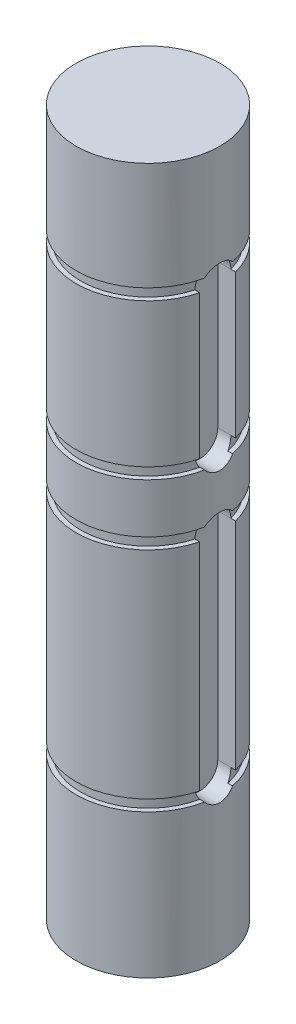
ISO-10303-21;
HEADER;
FILE_DESCRIPTION(('STEP AP214'),'2;1');
FILE_NAME('part.step','',(''),(''),'','','');
FILE_SCHEMA(('AUTOMOTIVE_DESIGN { 1 0 10303 214 1 1 1 1 }'));
ENDSEC;
DATA;
#1=APPLICATION_CONTEXT('core data for automotive mechanical design processes');
#2=APPLICATION_PROTOCOL_DEFINITION('international standard','automotive_design',2000,#1);
#3=PRODUCT_CONTEXT('',#1,'mechanical');
#4=PRODUCT('Part','Part','',(#3));
#5=PRODUCT_RELATED_PRODUCT_CATEGORY('part','',(#4));
#6=PRODUCT_DEFINITION_FORMATION('','',#4);
#7=PRODUCT_DEFINITION_CONTEXT('part definition',#1,'design');
#8=PRODUCT_DEFINITION('design','',#6,#7);
#9=PRODUCT_DEFINITION_SHAPE('','',#8);
#10=(LENGTH_UNIT() NAMED_UNIT(*) SI_UNIT(.MILLI.,.METRE.));
#11=(NAMED_UNIT(*) PLANE_ANGLE_UNIT() SI_UNIT($,.RADIAN.));
#12=(NAMED_UNIT(*) SI_UNIT($,.STERADIAN.) SOLID_ANGLE_UNIT());
#13=UNCERTAINTY_MEASURE_WITH_UNIT(LENGTH_MEASURE(1.E-05),#10,'distance_accuracy_value','');
#14=(GEOMETRIC_REPRESENTATION_CONTEXT(3) GLOBAL_UNCERTAINTY_ASSIGNED_CONTEXT((#13)) GLOBAL_UNIT_ASSIGNED_CONTEXT((#10,
#11,#12)) REPRESENTATION_CONTEXT('',''));
#15=CARTESIAN_POINT('',(0.,0.,0.));
#16=DIRECTION('',(0.,0.,1.));
#17=DIRECTION('',(1.,0.,0.));
#18=AXIS2_PLACEMENT_3D('',#15,#16,#17);
#19=CARTESIAN_POINT('',(0.,12.89,12.5023417993646));
#20=DIRECTION('',(0.,-1.,0.));
#21=DIRECTION('',(0.,0.,-1.));
#22=AXIS2_PLACEMENT_3D('',#19,#20,#21);
#23=PLANE('',#22);
#24=DIRECTION('',(1.,0.,0.));
#25=VECTOR('',#24,1.);
#26=CARTESIAN_POINT('',(1.8,12.89,-0.625));
#27=LINE('',#26,#25);
#28=CARTESIAN_POINT('',(2.25498891349825,12.89,-0.625));
#29=VERTEX_POINT('',#28);
#30=CARTESIAN_POINT('',(2.42061459137964,12.89,-0.625));
#31=VERTEX_POINT('',#30);
#32=EDGE_CURVE('E206',#29,#31,#27,.T.);
#33=ORIENTED_EDGE('',*,*,#32,.T.);
#34=CARTESIAN_POINT('',(0.,12.89,0.));
#35=DIRECTION('',(0.,-1.,0.));
#36=DIRECTION('',(0.,0.,-1.));
#37=AXIS2_PLACEMENT_3D('',#34,#35,#36);
#38=CIRCLE('',#37,2.5);
#39=CARTESIAN_POINT('',(2.42061459137964,12.89,0.625));
#40=VERTEX_POINT('',#39);
#41=EDGE_CURVE('E351',#40,#31,#38,.T.);
#42=ORIENTED_EDGE('',*,*,#41,.F.);
#43=DIRECTION('',(1.,0.,0.));
#44=VECTOR('',#43,1.);
#45=CARTESIAN_POINT('',(1.8,12.89,0.625));
#46=LINE('',#45,#44);
#47=CARTESIAN_POINT('',(2.25498891349825,12.89,0.625));
#48=VERTEX_POINT('',#47);
#49=EDGE_CURVE('E185',#48,#40,#46,.T.);
#50=ORIENTED_EDGE('',*,*,#49,.F.);
#51=CARTESIAN_POINT('',(0.,12.89,0.));
#52=DIRECTION('',(0.,1.,0.));
#53=DIRECTION('',(0.,0.,1.));
#54=AXIS2_PLACEMENT_3D('',#51,#52,#53);
#55=CIRCLE('',#54,2.34);
#56=EDGE_CURVE('E358',#29,#48,#55,.T.);
#57=ORIENTED_EDGE('',*,*,#56,.F.);
#58=EDGE_LOOP('',(#33,#42,#50,#57));
#59=FACE_BOUND('',#58,.T.);
#60=ADVANCED_FACE('F33',(#59),#23,.F.);
#61=CARTESIAN_POINT('',(0.,24.53,0.));
#62=DIRECTION('',(0.,-1.,0.));
#63=DIRECTION('',(0.,0.,-1.));
#64=AXIS2_PLACEMENT_3D('',#61,#62,#63);
#65=CYLINDRICAL_SURFACE('',#64,2.5);
#66=DIRECTION('',(0.,-1.,0.));
#67=VECTOR('',#66,1.);
#68=CARTESIAN_POINT('',(2.42061459137964,24.53,-0.624999999999998));
#69=LINE('',#68,#67);
#70=CARTESIAN_POINT('',(2.42061459137964,5.39,-0.624999999999999));
#71=VERTEX_POINT('',#70);
#72=EDGE_CURVE('E670',#71,#31,#69,.F.);
#73=ORIENTED_EDGE('',*,*,#72,.F.);
#74=CARTESIAN_POINT('',(0.,5.39,0.));
#75=DIRECTION('',(0.,1.,0.));
#76=DIRECTION('',(0.,0.,1.));
#77=AXIS2_PLACEMENT_3D('',#74,#75,#76);
#78=CIRCLE('',#77,2.5);
#79=CARTESIAN_POINT('',(2.42061459137964,5.39,0.624999999999999));
#80=VERTEX_POINT('',#79);
#81=EDGE_CURVE('E347',#71,#80,#78,.T.);
#82=ORIENTED_EDGE('',*,*,#81,.T.);
#83=DIRECTION('',(0.,-1.,0.));
#84=VECTOR('',#83,1.);
#85=CARTESIAN_POINT('',(2.42061459137964,24.53,0.625000000000001));
#86=LINE('',#85,#84);
#87=EDGE_CURVE('E672',#80,#40,#86,.F.);
#88=ORIENTED_EDGE('',*,*,#87,.T.);
#89=ORIENTED_EDGE('',*,*,#41,.T.);
#90=EDGE_LOOP('',(#73,#82,#88,#89));
#91=FACE_BOUND('',#90,.T.);
#92=ADVANCED_FACE('F432',(#91),#65,.T.);
#93=DIRECTION('',(0.,-1.,0.));
#94=VECTOR('',#93,1.);
#95=CARTESIAN_POINT('',(2.42061459137964,24.53,-0.624999999999999));
#96=LINE('',#95,#94);
#97=CARTESIAN_POINT('',(2.42061459137964,15.39,-0.624999999999999));
#98=VERTEX_POINT('',#97);
#99=CARTESIAN_POINT('',(2.42061459137964,20.39,-0.625));
#100=VERTEX_POINT('',#99);
#101=EDGE_CURVE('E460',#98,#100,#96,.F.);
#102=ORIENTED_EDGE('',*,*,#101,.F.);
#103=CARTESIAN_POINT('',(0.,15.39,0.));
#104=DIRECTION('',(0.,1.,0.));
#105=DIRECTION('',(0.,0.,1.));
#106=AXIS2_PLACEMENT_3D('',#103,#104,#105);
#107=CIRCLE('',#106,2.5);
#108=CARTESIAN_POINT('',(2.42061459137964,15.39,0.624999999999999));
#109=VERTEX_POINT('',#108);
#110=EDGE_CURVE('E363',#98,#109,#107,.T.);
#111=ORIENTED_EDGE('',*,*,#110,.T.);
#112=DIRECTION('',(0.,-1.,0.));
#113=VECTOR('',#112,1.);
#114=CARTESIAN_POINT('',(2.42061459137964,24.53,0.625));
#115=LINE('',#114,#113);
#116=CARTESIAN_POINT('',(2.42061459137964,20.39,0.625));
#117=VERTEX_POINT('',#116);
#118=EDGE_CURVE('E458',#109,#117,#115,.F.);
#119=ORIENTED_EDGE('',*,*,#118,.T.);
#120=CARTESIAN_POINT('',(0.,20.39,0.));
#121=DIRECTION('',(0.,-1.,0.));
#122=DIRECTION('',(0.,0.,-1.));
#123=AXIS2_PLACEMENT_3D('',#120,#121,#122);
#124=CIRCLE('',#123,2.5);
#125=EDGE_CURVE('E367',#117,#100,#124,.T.);
#126=ORIENTED_EDGE('',*,*,#125,.T.);
#127=EDGE_LOOP('',(#102,#111,#119,#126));
#128=FACE_BOUND('',#127,.T.);
#129=ADVANCED_FACE('F437',(#128),#65,.T.);
#130=CARTESIAN_POINT('',(0.,20.39,8.62693784667899));
#131=DIRECTION('',(0.,-1.,0.));
#132=DIRECTION('',(0.,0.,-1.));
#133=AXIS2_PLACEMENT_3D('',#130,#131,#132);
#134=PLANE('',#133);
#135=DIRECTION('',(1.,0.,0.));
#136=VECTOR('',#135,1.);
#137=CARTESIAN_POINT('',(1.8,20.39,-0.625));
#138=LINE('',#137,#136);
#139=CARTESIAN_POINT('',(2.25498891349825,20.39,-0.625));
#140=VERTEX_POINT('',#139);
#141=EDGE_CURVE('E296',#140,#100,#138,.T.);
#142=ORIENTED_EDGE('',*,*,#141,.T.);
#143=ORIENTED_EDGE('',*,*,#125,.F.);
#144=DIRECTION('',(1.,0.,0.));
#145=VECTOR('',#144,1.);
#146=CARTESIAN_POINT('',(1.8,20.39,0.625));
#147=LINE('',#146,#145);
#148=CARTESIAN_POINT('',(2.25498891349825,20.39,0.625));
#149=VERTEX_POINT('',#148);
#150=EDGE_CURVE('E292',#149,#117,#147,.T.);
#151=ORIENTED_EDGE('',*,*,#150,.F.);
#152=CARTESIAN_POINT('',(0.,20.39,0.));
#153=DIRECTION('',(0.,1.,0.));
#154=DIRECTION('',(0.,0.,1.));
#155=AXIS2_PLACEMENT_3D('',#152,#153,#154);
#156=CIRCLE('',#155,2.34);
#157=EDGE_CURVE('E374',#140,#149,#156,.T.);
#158=ORIENTED_EDGE('',*,*,#157,.F.);
#159=EDGE_LOOP('',(#142,#143,#151,#158));
#160=FACE_BOUND('',#159,.T.);
#161=ADVANCED_FACE('F477',(#160),#134,.F.);
#162=CARTESIAN_POINT('',(0.,20.78,8.62693784667899));
#163=DIRECTION('',(0.,1.,0.));
#164=DIRECTION('',(0.,0.,1.));
#165=AXIS2_PLACEMENT_3D('',#162,#163,#164);
#166=PLANE('',#165);
#167=CARTESIAN_POINT('',(0.,20.78,0.));
#168=DIRECTION('',(0.,1.,0.));
#169=DIRECTION('',(0.,0.,1.));
#170=AXIS2_PLACEMENT_3D('',#167,#168,#169);
#171=CIRCLE('',#170,2.34);
#172=CARTESIAN_POINT('',(2.28846564317667,20.78,-0.488390212842148));
#173=VERTEX_POINT('',#172);
#174=CARTESIAN_POINT('',(2.28846564317667,20.78,0.488390212842148));
#175=VERTEX_POINT('',#174);
#176=EDGE_CURVE('E362',#173,#175,#171,.T.);
#177=ORIENTED_EDGE('',*,*,#176,.T.);
#178=DIRECTION('',(1.,0.,0.));
#179=VECTOR('',#178,1.);
#180=CARTESIAN_POINT('',(1.8,20.78,0.488390212842148));
#181=LINE('',#180,#179);
#182=CARTESIAN_POINT('',(2.45183094849543,20.78,0.488390212842148));
#183=VERTEX_POINT('',#182);
#184=EDGE_CURVE('E466',#175,#183,#181,.T.);
#185=ORIENTED_EDGE('',*,*,#184,.T.);
#186=CARTESIAN_POINT('',(0.,20.78,0.));
#187=DIRECTION('',(0.,1.,0.));
#188=DIRECTION('',(0.,0.,1.));
#189=AXIS2_PLACEMENT_3D('',#186,#187,#188);
#190=CIRCLE('',#189,2.5);
#191=CARTESIAN_POINT('',(2.45183094849543,20.78,-0.488390212842148));
#192=VERTEX_POINT('',#191);
#193=EDGE_CURVE('E371',#192,#183,#190,.T.);
#194=ORIENTED_EDGE('',*,*,#193,.F.);
#195=DIRECTION('',(1.,0.,0.));
#196=VECTOR('',#195,1.);
#197=CARTESIAN_POINT('',(1.8,20.78,-0.488390212842148));
#198=LINE('',#197,#196);
#199=EDGE_CURVE('E463',#192,#173,#198,.F.);
#200=ORIENTED_EDGE('',*,*,#199,.T.);
#201=EDGE_LOOP('',(#177,#185,#194,#200));
#202=FACE_BOUND('',#201,.T.);
#203=ADVANCED_FACE('F481',(#202),#166,.F.);
#204=CARTESIAN_POINT('',(0.,23.1041049337605,0.));
#205=DIRECTION('',(0.,1.,0.));
#206=DIRECTION('',(0.,0.,1.));
#207=AXIS2_PLACEMENT_3D('',#204,#205,#206);
#208=CYLINDRICAL_SURFACE('',#207,2.34);
#209=ORIENTED_EDGE('',*,*,#157,.T.);
#210=CARTESIAN_POINT('',(2.25498891349825,20.39,0.625));
#211=CARTESIAN_POINT('',(2.2549577676071,20.4249451676806,0.625031242881272));
#212=CARTESIAN_POINT('',(2.25580142119508,20.4598639742977,0.622070107792589));
#213=CARTESIAN_POINT('',(2.25895007377119,20.5277027398278,0.610576459427106));
#214=CARTESIAN_POINT('',(2.26121368163625,20.5606512841825,0.602201551401814));
#215=CARTESIAN_POINT('',(2.26706996716942,20.6261109133674,0.579765859672453));
#216=CARTESIAN_POINT('',(2.27071829563075,20.6585342964658,0.56546430145991));
#217=CARTESIAN_POINT('',(2.27898384198626,20.7213752345228,0.531171536249049));
#218=CARTESIAN_POINT('',(2.28362684375595,20.751703429967,0.511022506756539));
#219=CARTESIAN_POINT('',(2.28846564317667,20.78,0.48839021284215));
#220=B_SPLINE_CURVE_WITH_KNOTS('',3,(#210,#211,#212,#213,#214,#215,#216,#217,#218,#219),
.UNSPECIFIED.,.F.,.F.,(4,2,2,2,4),(0.,0.104657709850374,0.206398045239264,0.312755280421556,
0.422303330243623),.UNSPECIFIED.);
#221=EDGE_CURVE('E396',#149,#175,#220,.T.);
#222=ORIENTED_EDGE('',*,*,#221,.T.);
#223=ORIENTED_EDGE('',*,*,#176,.F.);
#224=CARTESIAN_POINT('',(2.28846564317667,20.78,-0.488390212842148));
#225=CARTESIAN_POINT('',(2.28377829713318,20.7525732574471,-0.510321079523729));
#226=CARTESIAN_POINT('',(2.27927222148687,20.7232456660861,-0.529922187080843));
#227=CARTESIAN_POINT('',(2.27120447844851,20.6625098261347,-0.563495224923729));
#228=CARTESIAN_POINT('',(2.26761972594627,20.6311837706113,-0.57761054774785));
#229=CARTESIAN_POINT('',(2.2616098551308,20.5659739804003,-0.600727130319743));
#230=CARTESIAN_POINT('',(2.25920557537542,20.5320557151607,-0.60963698412414));
#231=CARTESIAN_POINT('',(2.25585465538172,20.4621223954405,-0.62187813661629));
#232=CARTESIAN_POINT('',(2.25495320411917,20.4260749974155,-0.625036746668475));
#233=CARTESIAN_POINT('',(2.25498891349825,20.39,-0.625));
#234=B_SPLINE_CURVE_WITH_KNOTS('',3,(#224,#225,#226,#227,#228,#229,#230,#231,#232,#233),
.UNSPECIFIED.,.F.,.F.,(4,2,2,2,4),(0.,0.106169432309089,0.20933931542815,0.314270232765197,
0.42230292818043),.UNSPECIFIED.);
#235=EDGE_CURVE('E403',#173,#140,#234,.T.);
#236=ORIENTED_EDGE('',*,*,#235,.T.);
#237=EDGE_LOOP('',(#209,#222,#223,#236));
#238=FACE_BOUND('',#237,.T.);
#239=ADVANCED_FACE('F408',(#238),#208,.T.);
#240=CARTESIAN_POINT('',(0.,24.53,0.));
#241=DIRECTION('',(0.,1.,0.));
#242=DIRECTION('',(0.,0.,1.));
#243=AXIS2_PLACEMENT_3D('',#240,#241,#242);
#244=PLANE('',#243);
#245=CARTESIAN_POINT('',(0.,24.53,0.));
#246=DIRECTION('',(0.,1.,0.));
#247=DIRECTION('',(0.,0.,1.));
#248=AXIS2_PLACEMENT_3D('',#245,#246,#247);
#249=CIRCLE('',#248,2.5);
#250=CARTESIAN_POINT('',(0.,24.53,2.5));
#251=VERTEX_POINT('',#250);
#252=EDGE_CURVE('E342',#251,#251,#249,.T.);
#253=ORIENTED_EDGE('',*,*,#252,.T.);
#254=EDGE_LOOP('',(#253));
#255=FACE_BOUND('',#254,.T.);
#256=ADVANCED_FACE('F486',(#255),#244,.T.);
#257=ORIENTED_EDGE('',*,*,#193,.T.);
#258=CARTESIAN_POINT('',(2.45183094849543,20.78,0.488390212842148));
#259=CARTESIAN_POINT('',(2.45620985079355,20.8075173550436,0.466446135173255));
#260=CARTESIAN_POINT('',(2.46073522955007,20.8331341262447,0.44215738345997));
#261=CARTESIAN_POINT('',(2.46959668145522,20.8799643442063,0.389604143855873));
#262=CARTESIAN_POINT('',(2.47393267692812,20.9011759973507,0.361338044349878));
#263=CARTESIAN_POINT('',(2.48193206156887,20.9385859134028,0.301538034793151));
#264=CARTESIAN_POINT('',(2.48559489195543,20.9547800189203,0.270001443630924));
#265=CARTESIAN_POINT('',(2.49183240360243,20.9816292851773,0.204569439455385));
#266=CARTESIAN_POINT('',(2.49440775858927,20.9922878762921,0.17067550210078));
#267=CARTESIAN_POINT('',(2.49814743480022,21.0075921843235,0.102075270104222));
#268=CARTESIAN_POINT('',(2.49933459123758,21.0123352975146,0.0673919786486284));
#269=CARTESIAN_POINT('',(2.50024172898899,21.0159689049068,-0.0023026692677025));
#270=CARTESIAN_POINT('',(2.49996165472389,21.0148591774004,-0.037314038105967));
#271=CARTESIAN_POINT('',(2.49798767082826,21.0069127391009,-0.105874799248247));
#272=CARTESIAN_POINT('',(2.49632412393997,21.0001990064931,-0.13943944458862));
#273=CARTESIAN_POINT('',(2.49180073116005,20.9814205546413,-0.204959205697208));
#274=CARTESIAN_POINT('',(2.48894057007017,20.9693544254805,-0.23691389490281));
#275=CARTESIAN_POINT('',(2.48228901347953,20.9400806489104,-0.298694706388594));
#276=CARTESIAN_POINT('',(2.47848772354245,20.9228179220008,-0.328493557902188));
#277=CARTESIAN_POINT('',(2.47037297246938,20.883691790764,-0.384793070669469));
#278=CARTESIAN_POINT('',(2.46606009386891,20.8618335976959,-0.411297414178231));
#279=CARTESIAN_POINT('',(2.4600624671058,20.8288766288402,-0.445178439841574));
#280=CARTESIAN_POINT('',(2.45840021313174,20.8194736153385,-0.45425595943543));
#281=CARTESIAN_POINT('',(2.45509547337905,20.8001333528006,-0.471789471966369));
#282=CARTESIAN_POINT('',(2.45345295711914,20.7901971076006,-0.480246566408101));
#283=CARTESIAN_POINT('',(2.45183094849542,20.78,-0.48839021284218));
#284=B_SPLINE_CURVE_WITH_KNOTS('',3,(#258,#259,#260,#261,#262,#263,#264,#265,#266,#267,#268,
#269,#270,#271,#272,#273,#274,#275,#276,#277,#278,#279,#280,#281,#282,#283),.UNSPECIFIED.,.F.,
.F.,(4,2,2,2,2,2,2,2,2,2,2,2,4),(0.,0.10627182953902,0.2125868449289,0.318989715642156,
0.425326569252451,0.529888464917007,0.634454321447657,0.736784052545579,0.839140755143269,
0.942623020441687,1.04598856376482,1.08549382972696,1.12492716962116),.UNSPECIFIED.);
#285=EDGE_CURVE('E248',#183,#192,#284,.T.);
#286=ORIENTED_EDGE('',*,*,#285,.T.);
#287=EDGE_LOOP('',(#257,#286));
#288=FACE_BOUND('',#287,.T.);
#289=ORIENTED_EDGE('',*,*,#252,.F.);
#290=EDGE_LOOP('',(#289));
#291=FACE_BOUND('',#290,.T.);
#292=ADVANCED_FACE('F35',(#288,#291),#65,.T.);
#293=CARTESIAN_POINT('',(0.,15.,16.9583287553793));
#294=DIRECTION('',(0.,-1.,0.));
#295=DIRECTION('',(0.,0.,-1.));
#296=AXIS2_PLACEMENT_3D('',#293,#294,#295);
#297=PLANE('',#296);
#298=CARTESIAN_POINT('',(0.,15.,0.));
#299=DIRECTION('',(0.,1.,0.));
#300=DIRECTION('',(0.,0.,1.));
#301=AXIS2_PLACEMENT_3D('',#298,#299,#300);
#302=CIRCLE('',#301,2.34);
#303=CARTESIAN_POINT('',(2.28846564317667,15.,-0.488390212842147));
#304=VERTEX_POINT('',#303);
#305=CARTESIAN_POINT('',(2.28846564317667,15.,0.488390212842149));
#306=VERTEX_POINT('',#305);
#307=EDGE_CURVE('E366',#304,#306,#302,.T.);
#308=ORIENTED_EDGE('',*,*,#307,.F.);
#309=DIRECTION('',(1.,0.,0.));
#310=VECTOR('',#309,1.);
#311=CARTESIAN_POINT('',(1.8,15.,-0.488390212842147));
#312=LINE('',#311,#310);
#313=CARTESIAN_POINT('',(2.45183094849543,15.,-0.488390212842147));
#314=VERTEX_POINT('',#313);
#315=EDGE_CURVE('E309',#304,#314,#312,.T.);
#316=ORIENTED_EDGE('',*,*,#315,.T.);
#317=CARTESIAN_POINT('',(0.,15.,0.));
#318=DIRECTION('',(0.,-1.,0.));
#319=DIRECTION('',(0.,0.,-1.));
#320=AXIS2_PLACEMENT_3D('',#317,#318,#319);
#321=CIRCLE('',#320,2.5);
#322=CARTESIAN_POINT('',(2.45183094849543,15.,0.488390212842149));
#323=VERTEX_POINT('',#322);
#324=EDGE_CURVE('E359',#323,#314,#321,.T.);
#325=ORIENTED_EDGE('',*,*,#324,.F.);
#326=DIRECTION('',(1.,0.,0.));
#327=VECTOR('',#326,1.);
#328=CARTESIAN_POINT('',(1.8,15.,0.488390212842149));
#329=LINE('',#328,#327);
#330=EDGE_CURVE('E62',#323,#306,#329,.F.);
#331=ORIENTED_EDGE('',*,*,#330,.T.);
#332=EDGE_LOOP('',(#308,#316,#325,#331));
#333=FACE_BOUND('',#332,.T.);
#334=ADVANCED_FACE('F442',(#333),#297,.F.);
#335=CARTESIAN_POINT('',(0.,15.39,16.9583287553793));
#336=DIRECTION('',(0.,1.,0.));
#337=DIRECTION('',(0.,0.,1.));
#338=AXIS2_PLACEMENT_3D('',#335,#336,#337);
#339=PLANE('',#338);
#340=ORIENTED_EDGE('',*,*,#110,.F.);
#341=DIRECTION('',(1.,0.,0.));
#342=VECTOR('',#341,1.);
#343=CARTESIAN_POINT('',(1.8,15.39,-0.624999999999999));
#344=LINE('',#343,#342);
#345=CARTESIAN_POINT('',(2.25498891349825,15.39,-0.624999999999999));
#346=VERTEX_POINT('',#345);
#347=EDGE_CURVE('E300',#346,#98,#344,.T.);
#348=ORIENTED_EDGE('',*,*,#347,.F.);
#349=CARTESIAN_POINT('',(0.,15.39,0.));
#350=DIRECTION('',(0.,1.,0.));
#351=DIRECTION('',(0.,0.,1.));
#352=AXIS2_PLACEMENT_3D('',#349,#350,#351);
#353=CIRCLE('',#352,2.34);
#354=CARTESIAN_POINT('',(2.25498891349825,15.39,0.624999999999999));
#355=VERTEX_POINT('',#354);
#356=EDGE_CURVE('E354',#346,#355,#353,.T.);
#357=ORIENTED_EDGE('',*,*,#356,.T.);
#358=DIRECTION('',(1.,0.,0.));
#359=VECTOR('',#358,1.);
#360=CARTESIAN_POINT('',(1.8,15.39,0.624999999999999));
#361=LINE('',#360,#359);
#362=EDGE_CURVE('E304',#355,#109,#361,.T.);
#363=ORIENTED_EDGE('',*,*,#362,.T.);
#364=EDGE_LOOP('',(#340,#348,#357,#363));
#365=FACE_BOUND('',#364,.T.);
#366=ADVANCED_FACE('F440',(#365),#339,.F.);
#367=CARTESIAN_POINT('',(0.,18.594919623717,0.));
#368=DIRECTION('',(0.,1.,0.));
#369=DIRECTION('',(0.,0.,1.));
#370=AXIS2_PLACEMENT_3D('',#367,#368,#369);
#371=CYLINDRICAL_SURFACE('',#370,2.34);
#372=ORIENTED_EDGE('',*,*,#307,.T.);
#373=CARTESIAN_POINT('',(2.28846564317667,15.,0.488390212842149));
#374=CARTESIAN_POINT('',(2.28377829713318,15.0274267425529,0.510321079523729));
#375=CARTESIAN_POINT('',(2.27927222148687,15.0567543339139,0.529922187080843));
#376=CARTESIAN_POINT('',(2.27120447844851,15.1174901738653,0.563495224923729));
#377=CARTESIAN_POINT('',(2.26761972594627,15.1488162293887,0.577610547747851));
#378=CARTESIAN_POINT('',(2.2616098551308,15.2140260195997,0.600727130319745));
#379=CARTESIAN_POINT('',(2.25920557537542,15.2479442848393,0.609636984124141));
#380=CARTESIAN_POINT('',(2.25585465538172,15.3178776045595,0.621878136616291));
#381=CARTESIAN_POINT('',(2.25495320411917,15.3539250025845,0.625036746668475));
#382=CARTESIAN_POINT('',(2.25498891349825,15.39,0.625000000000001));
#383=B_SPLINE_CURVE_WITH_KNOTS('',3,(#373,#374,#375,#376,#377,#378,#379,#380,#381,#382),
.UNSPECIFIED.,.F.,.F.,(4,2,2,2,4),(0.,0.106169432309088,0.209339315428148,0.314270232765198,
0.422302928180429),.UNSPECIFIED.);
#384=EDGE_CURVE('E320',#306,#355,#383,.T.);
#385=ORIENTED_EDGE('',*,*,#384,.T.);
#386=ORIENTED_EDGE('',*,*,#356,.F.);
#387=CARTESIAN_POINT('',(2.25498891349825,15.39,-0.624999999999999));
#388=CARTESIAN_POINT('',(2.2549577676071,15.3550548323194,-0.625031242881272));
#389=CARTESIAN_POINT('',(2.25580142119508,15.3201360257023,-0.622070107792589));
#390=CARTESIAN_POINT('',(2.25895007377119,15.2522972601722,-0.610576459427105));
#391=CARTESIAN_POINT('',(2.26121368163625,15.2193487158175,-0.602201551401812));
#392=CARTESIAN_POINT('',(2.26706996716942,15.1538890866326,-0.579765859672451));
#393=CARTESIAN_POINT('',(2.27071829563075,15.1214657035342,-0.565464301459907));
#394=CARTESIAN_POINT('',(2.27898384198626,15.0586247654772,-0.531171536249046));
#395=CARTESIAN_POINT('',(2.28362684375595,15.028296570033,-0.511022506756535));
#396=CARTESIAN_POINT('',(2.28846564317667,15.,-0.488390212842147));
#397=B_SPLINE_CURVE_WITH_KNOTS('',3,(#387,#388,#389,#390,#391,#392,#393,#394,#395,#396),
.UNSPECIFIED.,.F.,.F.,(4,2,2,2,4),(0.,0.104657709850377,0.206398045239264,0.312755280421562,
0.422303330243626),.UNSPECIFIED.);
#398=EDGE_CURVE('E312',#346,#304,#397,.T.);
#399=ORIENTED_EDGE('',*,*,#398,.T.);
#400=EDGE_LOOP('',(#372,#385,#386,#399));
#401=FACE_BOUND('',#400,.T.);
#402=ADVANCED_FACE('F325',(#401),#371,.T.);
#403=CARTESIAN_POINT('',(0.,13.28,0.));
#404=DIRECTION('',(0.,1.,0.));
#405=DIRECTION('',(0.,0.,1.));
#406=AXIS2_PLACEMENT_3D('',#403,#404,#405);
#407=CIRCLE('',#406,2.5);
#408=CARTESIAN_POINT('',(2.45183094849543,13.28,-0.488390212842148));
#409=VERTEX_POINT('',#408);
#410=CARTESIAN_POINT('',(2.45183094849543,13.28,0.488390212842148));
#411=VERTEX_POINT('',#410);
#412=EDGE_CURVE('E355',#409,#411,#407,.T.);
#413=ORIENTED_EDGE('',*,*,#412,.T.);
#414=CARTESIAN_POINT('',(2.45183094849543,13.28,0.488390212842148));
#415=CARTESIAN_POINT('',(2.45620985079355,13.3075173550436,0.466446135173255));
#416=CARTESIAN_POINT('',(2.46073522955007,13.3331341262447,0.44215738345997));
#417=CARTESIAN_POINT('',(2.46959668145522,13.3799643442063,0.389604143855873));
#418=CARTESIAN_POINT('',(2.47393267692812,13.4011759973507,0.361338044349878));
#419=CARTESIAN_POINT('',(2.48193206156887,13.4385859134028,0.301538034793152));
#420=CARTESIAN_POINT('',(2.48559489195543,13.4547800189204,0.270001443630925));
#421=CARTESIAN_POINT('',(2.49183240360243,13.4816292851774,0.204569439455385));
#422=CARTESIAN_POINT('',(2.49440775858927,13.4922878762921,0.170675502100779));
#423=CARTESIAN_POINT('',(2.49814743480022,13.5075921843235,0.10207527010422));
#424=CARTESIAN_POINT('',(2.49933459123758,13.5123352975146,0.0673919786486268));
#425=CARTESIAN_POINT('',(2.50024172898899,13.5159689049068,-0.00230266926770396));
#426=CARTESIAN_POINT('',(2.49996165472389,13.5148591774004,-0.0373140381059684));
#427=CARTESIAN_POINT('',(2.49798767082826,13.5069127391009,-0.105874799248248));
#428=CARTESIAN_POINT('',(2.49632412393997,13.5001990064931,-0.139439444588621));
#429=CARTESIAN_POINT('',(2.49180073116005,13.4814205546413,-0.204959205697209));
#430=CARTESIAN_POINT('',(2.48894057007017,13.4693544254805,-0.236913894902811));
#431=CARTESIAN_POINT('',(2.48228901347953,13.4400806489104,-0.298694706388594));
#432=CARTESIAN_POINT('',(2.47848772354245,13.4228179220008,-0.328493557902188));
#433=CARTESIAN_POINT('',(2.47037297246938,13.383691790764,-0.384793070669471));
#434=CARTESIAN_POINT('',(2.4660600938689,13.3618335976959,-0.411297414178233));
#435=CARTESIAN_POINT('',(2.4600624671058,13.3288766288402,-0.445178439841576));
#436=CARTESIAN_POINT('',(2.45840021313174,13.3194736153385,-0.454255959435432));
#437=CARTESIAN_POINT('',(2.45509547337905,13.3001333528005,-0.47178947196637));
#438=CARTESIAN_POINT('',(2.45345295711914,13.2901971076006,-0.480246566408101));
#439=CARTESIAN_POINT('',(2.45183094849542,13.28,-0.488390212842181));
#440=B_SPLINE_CURVE_WITH_KNOTS('',3,(#414,#415,#416,#417,#418,#419,#420,#421,#422,#423,#424,
#425,#426,#427,#428,#429,#430,#431,#432,#433,#434,#435,#436,#437,#438,#439),.UNSPECIFIED.,.F.,
.F.,(4,2,2,2,2,2,2,2,2,2,2,2,4),(0.,0.106271829539022,0.2125868449289,0.318989715642157,
0.425326569252453,0.529888464917009,0.634454321447659,0.73678405254558,0.839140755143271,
0.94262302044169,1.04598856376482,1.08549382972696,1.12492716962116),.UNSPECIFIED.);
#441=EDGE_CURVE('E270',#411,#409,#440,.T.);
#442=ORIENTED_EDGE('',*,*,#441,.T.);
#443=EDGE_LOOP('',(#413,#442));
#444=FACE_BOUND('',#443,.T.);
#445=ORIENTED_EDGE('',*,*,#324,.T.);
#446=CARTESIAN_POINT('',(2.45183094849543,15.,-0.488390212842147));
#447=CARTESIAN_POINT('',(2.45620985079355,14.9724826449564,-0.466446135173255));
#448=CARTESIAN_POINT('',(2.46073522955007,14.9468658737553,-0.442157383459969));
#449=CARTESIAN_POINT('',(2.46959668145522,14.9000356557937,-0.389604143855872));
#450=CARTESIAN_POINT('',(2.47393267692812,14.8788240026493,-0.361338044349877));
#451=CARTESIAN_POINT('',(2.48193206156887,14.8414140865972,-0.301538034793151));
#452=CARTESIAN_POINT('',(2.48559489195543,14.8252199810796,-0.270001443630925));
#453=CARTESIAN_POINT('',(2.49183240360243,14.7983707148226,-0.204569439455385));
#454=CARTESIAN_POINT('',(2.49440775858927,14.7877121237079,-0.170675502100779));
#455=CARTESIAN_POINT('',(2.49814743480022,14.7724078156765,-0.10207527010422));
#456=CARTESIAN_POINT('',(2.49933459123758,14.7676647024854,-0.0673919786486263));
#457=CARTESIAN_POINT('',(2.50024172898899,14.7640310950932,0.00230266926770442));
#458=CARTESIAN_POINT('',(2.49996165472389,14.7651408225996,0.0373140381059689));
#459=CARTESIAN_POINT('',(2.49798767082826,14.7730872608991,0.105874799248248));
#460=CARTESIAN_POINT('',(2.49632412393997,14.7798009935069,0.139439444588621));
#461=CARTESIAN_POINT('',(2.49180073116005,14.7985794453587,0.204959205697209));
#462=CARTESIAN_POINT('',(2.48894057007017,14.8106455745195,0.236913894902812));
#463=CARTESIAN_POINT('',(2.48228901347953,14.8399193510896,0.298694706388595));
#464=CARTESIAN_POINT('',(2.47848772354245,14.8571820779992,0.328493557902188));
#465=CARTESIAN_POINT('',(2.47037297246938,14.896308209236,0.384793070669471));
#466=CARTESIAN_POINT('',(2.4660600938689,14.9181664023041,0.411297414178234));
#467=CARTESIAN_POINT('',(2.46006246710579,14.9511233711598,0.445178439841577));
#468=CARTESIAN_POINT('',(2.45840021313174,14.9605263846615,0.454255959435433));
#469=CARTESIAN_POINT('',(2.45509547337905,14.9798666471995,0.471789471966371));
#470=CARTESIAN_POINT('',(2.45345295711914,14.9898028923994,0.480246566408102));
#471=CARTESIAN_POINT('',(2.45183094849542,15.,0.488390212842182));
#472=B_SPLINE_CURVE_WITH_KNOTS('',3,(#446,#447,#448,#449,#450,#451,#452,#453,#454,#455,#456,
#457,#458,#459,#460,#461,#462,#463,#464,#465,#466,#467,#468,#469,#470,#471),.UNSPECIFIED.,.F.,
.F.,(4,2,2,2,2,2,2,2,2,2,2,2,4),(0.,0.106271829539022,0.2125868449289,0.318989715642157,
0.425326569252453,0.529888464917009,0.634454321447658,0.73678405254558,0.839140755143271,
0.942623020441688,1.04598856376482,1.08549382972697,1.12492716962116),.UNSPECIFIED.);
#473=EDGE_CURVE('E337',#314,#323,#472,.T.);
#474=ORIENTED_EDGE('',*,*,#473,.T.);
#475=EDGE_LOOP('',(#445,#474));
#476=FACE_BOUND('',#475,.T.);
#477=ADVANCED_FACE('F448',(#444,#476),#65,.T.);
#478=CARTESIAN_POINT('',(0.,13.28,12.5023417993646));
#479=DIRECTION('',(0.,1.,0.));
#480=DIRECTION('',(0.,0.,1.));
#481=AXIS2_PLACEMENT_3D('',#478,#479,#480);
#482=PLANE('',#481);
#483=CARTESIAN_POINT('',(0.,13.28,0.));
#484=DIRECTION('',(0.,1.,0.));
#485=DIRECTION('',(0.,0.,1.));
#486=AXIS2_PLACEMENT_3D('',#483,#484,#485);
#487=CIRCLE('',#486,2.34);
#488=CARTESIAN_POINT('',(2.28846564317667,13.28,-0.488390212842148));
#489=VERTEX_POINT('',#488);
#490=CARTESIAN_POINT('',(2.28846564317667,13.28,0.488390212842148));
#491=VERTEX_POINT('',#490);
#492=EDGE_CURVE('E346',#489,#491,#487,.T.);
#493=ORIENTED_EDGE('',*,*,#492,.T.);
#494=DIRECTION('',(1.,0.,0.));
#495=VECTOR('',#494,1.);
#496=CARTESIAN_POINT('',(1.8,13.28,0.488390212842148));
#497=LINE('',#496,#495);
#498=EDGE_CURVE('E276',#491,#411,#497,.T.);
#499=ORIENTED_EDGE('',*,*,#498,.T.);
#500=ORIENTED_EDGE('',*,*,#412,.F.);
#501=DIRECTION('',(1.,0.,0.));
#502=VECTOR('',#501,1.);
#503=CARTESIAN_POINT('',(1.8,13.28,-0.488390212842148));
#504=LINE('',#503,#502);
#505=EDGE_CURVE('E277',#409,#489,#504,.F.);
#506=ORIENTED_EDGE('',*,*,#505,.T.);
#507=EDGE_LOOP('',(#493,#499,#500,#506));
#508=FACE_BOUND('',#507,.T.);
#509=ADVANCED_FACE('F505',(#508),#482,.F.);
#510=CARTESIAN_POINT('',(0.,14.5589137366958,0.));
#511=DIRECTION('',(0.,1.,0.));
#512=DIRECTION('',(0.,0.,1.));
#513=AXIS2_PLACEMENT_3D('',#510,#511,#512);
#514=CYLINDRICAL_SURFACE('',#513,2.34);
#515=ORIENTED_EDGE('',*,*,#56,.T.);
#516=CARTESIAN_POINT('',(2.25498891349825,12.89,0.625));
#517=CARTESIAN_POINT('',(2.2549577676071,12.9249451676806,0.625031242881272));
#518=CARTESIAN_POINT('',(2.25580142119508,12.9598639742977,0.62207010779259));
#519=CARTESIAN_POINT('',(2.25895007377119,13.0277027398278,0.610576459427105));
#520=CARTESIAN_POINT('',(2.26121368163625,13.0606512841825,0.602201551401813));
#521=CARTESIAN_POINT('',(2.26706996716942,13.1261109133674,0.579765859672451));
#522=CARTESIAN_POINT('',(2.27071829563075,13.1585342964658,0.565464301459909));
#523=CARTESIAN_POINT('',(2.27898384198626,13.2213752345228,0.531171536249047));
#524=CARTESIAN_POINT('',(2.28362684375595,13.251703429967,0.511022506756536));
#525=CARTESIAN_POINT('',(2.28846564317667,13.28,0.488390212842147));
#526=B_SPLINE_CURVE_WITH_KNOTS('',3,(#516,#517,#518,#519,#520,#521,#522,#523,#524,#525),
.UNSPECIFIED.,.F.,.F.,(4,2,2,2,4),(0.,0.104657709850377,0.206398045239264,0.31275528042156,
0.422303330243626),.UNSPECIFIED.);
#527=EDGE_CURVE('E11',#48,#491,#526,.T.);
#528=ORIENTED_EDGE('',*,*,#527,.T.);
#529=ORIENTED_EDGE('',*,*,#492,.F.);
#530=CARTESIAN_POINT('',(2.28846564317667,13.28,-0.488390212842148));
#531=CARTESIAN_POINT('',(2.28377829713318,13.2525732574471,-0.510321079523728));
#532=CARTESIAN_POINT('',(2.27927222148687,13.2232456660861,-0.529922187080842));
#533=CARTESIAN_POINT('',(2.27120447844851,13.1625098261347,-0.563495224923728));
#534=CARTESIAN_POINT('',(2.26761972594627,13.1311837706113,-0.57761054774785));
#535=CARTESIAN_POINT('',(2.2616098551308,13.0659739804003,-0.600727130319744));
#536=CARTESIAN_POINT('',(2.25920557537542,13.0320557151607,-0.60963698412414));
#537=CARTESIAN_POINT('',(2.25585465538172,12.9621223954405,-0.621878136616289));
#538=CARTESIAN_POINT('',(2.25495320411917,12.9260749974155,-0.625036746668474));
#539=CARTESIAN_POINT('',(2.25498891349825,12.89,-0.625));
#540=B_SPLINE_CURVE_WITH_KNOTS('',3,(#530,#531,#532,#533,#534,#535,#536,#537,#538,#539),
.UNSPECIFIED.,.F.,.F.,(4,2,2,2,4),(0.,0.106169432309088,0.209339315428148,0.314270232765198,
0.422302928180429),.UNSPECIFIED.);
#541=EDGE_CURVE('E47',#489,#29,#540,.T.);
#542=ORIENTED_EDGE('',*,*,#541,.T.);
#543=EDGE_LOOP('',(#515,#528,#529,#542));
#544=FACE_BOUND('',#543,.T.);
#545=ADVANCED_FACE('F258',(#544),#514,.T.);
#546=CARTESIAN_POINT('',(0.,5.,13.5092226514695));
#547=DIRECTION('',(0.,-1.,0.));
#548=DIRECTION('',(0.,0.,-1.));
#549=AXIS2_PLACEMENT_3D('',#546,#547,#548);
#550=PLANE('',#549);
#551=CARTESIAN_POINT('',(0.,5.,0.));
#552=DIRECTION('',(0.,1.,0.));
#553=DIRECTION('',(0.,0.,1.));
#554=AXIS2_PLACEMENT_3D('',#551,#552,#553);
#555=CIRCLE('',#554,2.34);
#556=CARTESIAN_POINT('',(2.28846564317667,5.,-0.488390212842149));
#557=VERTEX_POINT('',#556);
#558=CARTESIAN_POINT('',(2.28846564317667,5.,0.48839021284215));
#559=VERTEX_POINT('',#558);
#560=EDGE_CURVE('E350',#557,#559,#555,.T.);
#561=ORIENTED_EDGE('',*,*,#560,.F.);
#562=DIRECTION('',(1.,0.,0.));
#563=VECTOR('',#562,1.);
#564=CARTESIAN_POINT('',(1.8,5.,-0.488390212842149));
#565=LINE('',#564,#563);
#566=CARTESIAN_POINT('',(2.45183094849543,5.,-0.48839021284215));
#567=VERTEX_POINT('',#566);
#568=EDGE_CURVE('E213',#557,#567,#565,.T.);
#569=ORIENTED_EDGE('',*,*,#568,.T.);
#570=CARTESIAN_POINT('',(0.,5.,0.));
#571=DIRECTION('',(0.,-1.,0.));
#572=DIRECTION('',(0.,0.,-1.));
#573=AXIS2_PLACEMENT_3D('',#570,#571,#572);
#574=CIRCLE('',#573,2.5);
#575=CARTESIAN_POINT('',(2.45183094849543,5.,0.488390212842152));
#576=VERTEX_POINT('',#575);
#577=EDGE_CURVE('E343',#576,#567,#574,.T.);
#578=ORIENTED_EDGE('',*,*,#577,.F.);
#579=DIRECTION('',(1.,0.,0.));
#580=VECTOR('',#579,1.);
#581=CARTESIAN_POINT('',(1.8,5.,0.48839021284215));
#582=LINE('',#581,#580);
#583=EDGE_CURVE('E54',#576,#559,#582,.F.);
#584=ORIENTED_EDGE('',*,*,#583,.T.);
#585=EDGE_LOOP('',(#561,#569,#578,#584));
#586=FACE_BOUND('',#585,.T.);
#587=ADVANCED_FACE('F421',(#586),#550,.F.);
#588=CARTESIAN_POINT('',(0.,5.39,13.5092226514695));
#589=DIRECTION('',(0.,1.,0.));
#590=DIRECTION('',(0.,0.,1.));
#591=AXIS2_PLACEMENT_3D('',#588,#589,#590);
#592=PLANE('',#591);
#593=ORIENTED_EDGE('',*,*,#81,.F.);
#594=DIRECTION('',(1.,0.,0.));
#595=VECTOR('',#594,1.);
#596=CARTESIAN_POINT('',(1.8,5.39,-0.624999999999999));
#597=LINE('',#596,#595);
#598=CARTESIAN_POINT('',(2.25498891349825,5.39,-0.624999999999999));
#599=VERTEX_POINT('',#598);
#600=EDGE_CURVE('E210',#599,#71,#597,.T.);
#601=ORIENTED_EDGE('',*,*,#600,.F.);
#602=CARTESIAN_POINT('',(0.,5.39,0.));
#603=DIRECTION('',(0.,1.,0.));
#604=DIRECTION('',(0.,0.,1.));
#605=AXIS2_PLACEMENT_3D('',#602,#603,#604);
#606=CIRCLE('',#605,2.34);
#607=CARTESIAN_POINT('',(2.25498891349825,5.39,0.624999999999999));
#608=VERTEX_POINT('',#607);
#609=EDGE_CURVE('E393',#599,#608,#606,.T.);
#610=ORIENTED_EDGE('',*,*,#609,.T.);
#611=DIRECTION('',(1.,0.,0.));
#612=VECTOR('',#611,1.);
#613=CARTESIAN_POINT('',(1.8,5.39,0.624999999999999));
#614=LINE('',#613,#612);
#615=EDGE_CURVE('E184',#608,#80,#614,.T.);
#616=ORIENTED_EDGE('',*,*,#615,.T.);
#617=EDGE_LOOP('',(#593,#601,#610,#616));
#618=FACE_BOUND('',#617,.T.);
#619=ADVANCED_FACE('F417',(#618),#592,.F.);
#620=CARTESIAN_POINT('',(0.,6.26451819914511,0.));
#621=DIRECTION('',(0.,1.,0.));
#622=DIRECTION('',(0.,0.,1.));
#623=AXIS2_PLACEMENT_3D('',#620,#621,#622);
#624=CYLINDRICAL_SURFACE('',#623,2.34);
#625=ORIENTED_EDGE('',*,*,#560,.T.);
#626=CARTESIAN_POINT('',(2.28846564317667,5.,0.48839021284215));
#627=CARTESIAN_POINT('',(2.28377829713318,5.02742674255293,0.51032107952373));
#628=CARTESIAN_POINT('',(2.27927222148687,5.05675433391386,0.529922187080844));
#629=CARTESIAN_POINT('',(2.27120447844851,5.11749017386525,0.56349522492373));
#630=CARTESIAN_POINT('',(2.26761972594627,5.14881622938867,0.577610547747852));
#631=CARTESIAN_POINT('',(2.2616098551308,5.21402601959969,0.600727130319746));
#632=CARTESIAN_POINT('',(2.25920557537542,5.24794428483928,0.609636984124141));
#633=CARTESIAN_POINT('',(2.25585465538172,5.31787760455948,0.621878136616291));
#634=CARTESIAN_POINT('',(2.25495320411917,5.35392500258454,0.625036746668475));
#635=CARTESIAN_POINT('',(2.25498891349825,5.39,0.625000000000001));
#636=B_SPLINE_CURVE_WITH_KNOTS('',3,(#626,#627,#628,#629,#630,#631,#632,#633,#634,#635),
.UNSPECIFIED.,.F.,.F.,(4,2,2,2,4),(0.,0.106169432309089,0.209339315428149,0.314270232765198,
0.422302928180429),.UNSPECIFIED.);
#637=EDGE_CURVE('E224',#559,#608,#636,.T.);
#638=ORIENTED_EDGE('',*,*,#637,.T.);
#639=ORIENTED_EDGE('',*,*,#609,.F.);
#640=CARTESIAN_POINT('',(2.25498891349825,5.39,-0.624999999999999));
#641=CARTESIAN_POINT('',(2.2549577676071,5.3550548323194,-0.625031242881272));
#642=CARTESIAN_POINT('',(2.25580142119508,5.32013602570229,-0.622070107792589));
#643=CARTESIAN_POINT('',(2.25895007377119,5.2522972601722,-0.610576459427105));
#644=CARTESIAN_POINT('',(2.26121368163625,5.21934871581749,-0.602201551401813));
#645=CARTESIAN_POINT('',(2.26706996716942,5.15388908663257,-0.579765859672451));
#646=CARTESIAN_POINT('',(2.27071829563075,5.12146570353419,-0.565464301459908));
#647=CARTESIAN_POINT('',(2.27898384198626,5.05862476547722,-0.531171536249047));
#648=CARTESIAN_POINT('',(2.28362684375595,5.02829657003297,-0.511022506756537));
#649=CARTESIAN_POINT('',(2.28846564317667,5.,-0.488390212842149));
#650=B_SPLINE_CURVE_WITH_KNOTS('',3,(#640,#641,#642,#643,#644,#645,#646,#647,#648,#649),
.UNSPECIFIED.,.F.,.F.,(4,2,2,2,4),(0.,0.104657709850376,0.206398045239264,0.312755280421561,
0.422303330243625),.UNSPECIFIED.);
#651=EDGE_CURVE('E216',#599,#557,#650,.T.);
#652=ORIENTED_EDGE('',*,*,#651,.T.);
#653=EDGE_LOOP('',(#625,#638,#639,#652));
#654=FACE_BOUND('',#653,.T.);
#655=ADVANCED_FACE('F229',(#654),#624,.T.);
#656=CARTESIAN_POINT('',(0.,0.,0.));
#657=DIRECTION('',(0.,1.,0.));
#658=DIRECTION('',(0.,0.,1.));
#659=AXIS2_PLACEMENT_3D('',#656,#657,#658);
#660=PLANE('',#659);
#661=CARTESIAN_POINT('',(0.,0.,0.));
#662=DIRECTION('',(0.,1.,0.));
#663=DIRECTION('',(0.,0.,1.));
#664=AXIS2_PLACEMENT_3D('',#661,#662,#663);
#665=CIRCLE('',#664,2.5);
#666=CARTESIAN_POINT('',(0.,0.,2.5));
#667=VERTEX_POINT('',#666);
#668=EDGE_CURVE('E370',#667,#667,#665,.T.);
#669=ORIENTED_EDGE('',*,*,#668,.F.);
#670=EDGE_LOOP('',(#669));
#671=FACE_BOUND('',#670,.T.);
#672=ADVANCED_FACE('F427',(#671),#660,.F.);
#673=ORIENTED_EDGE('',*,*,#577,.T.);
#674=CARTESIAN_POINT('',(2.45183094849543,5.,-0.48839021284215));
#675=CARTESIAN_POINT('',(2.45620985079355,4.97248264495636,-0.466446135173256));
#676=CARTESIAN_POINT('',(2.46073522955007,4.94686587375532,-0.442157383459971));
#677=CARTESIAN_POINT('',(2.46959668145522,4.90003565579371,-0.389604143855874));
#678=CARTESIAN_POINT('',(2.47393267692812,4.87882400264935,-0.361338044349879));
#679=CARTESIAN_POINT('',(2.48193206156887,4.84141408659721,-0.301538034793153));
#680=CARTESIAN_POINT('',(2.48559489195543,4.82521998107964,-0.270001443630926));
#681=CARTESIAN_POINT('',(2.49183240360243,4.79837071482265,-0.204569439455385));
#682=CARTESIAN_POINT('',(2.49440775858927,4.78771212370793,-0.17067550210078));
#683=CARTESIAN_POINT('',(2.49814743480022,4.77240781567652,-0.102075270104221));
#684=CARTESIAN_POINT('',(2.49933459123758,4.76766470248542,-0.0673919786486273));
#685=CARTESIAN_POINT('',(2.50024172898899,4.76403109509324,0.00230266926770355));
#686=CARTESIAN_POINT('',(2.49996165472389,4.7651408225996,0.037314038105968));
#687=CARTESIAN_POINT('',(2.49798767082826,4.77308726089907,0.105874799248248));
#688=CARTESIAN_POINT('',(2.49632412393997,4.77980099350691,0.139439444588621));
#689=CARTESIAN_POINT('',(2.49180073116005,4.79857944535873,0.204959205697209));
#690=CARTESIAN_POINT('',(2.48894057007017,4.8106455745195,0.236913894902811));
#691=CARTESIAN_POINT('',(2.48228901347953,4.83991935108958,0.298694706388594));
#692=CARTESIAN_POINT('',(2.47848772354245,4.85718207799921,0.328493557902188));
#693=CARTESIAN_POINT('',(2.47037297246938,4.89630820923602,0.384793070669471));
#694=CARTESIAN_POINT('',(2.4660600938689,4.91816640230414,0.411297414178233));
#695=CARTESIAN_POINT('',(2.46006246710579,4.95112337115979,0.445178439841577));
#696=CARTESIAN_POINT('',(2.45840021313174,4.96052638466151,0.454255959435433));
#697=CARTESIAN_POINT('',(2.45509547337905,4.97986664719945,0.471789471966373));
#698=CARTESIAN_POINT('',(2.45345295711914,4.98980289239937,0.480246566408105));
#699=CARTESIAN_POINT('',(2.45183094849542,4.99999999999997,0.488390212842185));
#700=B_SPLINE_CURVE_WITH_KNOTS('',3,(#674,#675,#676,#677,#678,#679,#680,#681,#682,#683,#684,
#685,#686,#687,#688,#689,#690,#691,#692,#693,#694,#695,#696,#697,#698,#699),.UNSPECIFIED.,.F.,
.F.,(4,2,2,2,2,2,2,2,2,2,2,2,4),(0.,0.106271829539024,0.212586844928902,0.31898971564216,
0.425326569252455,0.529888464917012,0.634454321447662,0.736784052545583,0.839140755143274,
0.942623020441693,1.04598856376482,1.08549382972697,1.12492716962117),.UNSPECIFIED.);
#701=EDGE_CURVE('E243',#567,#576,#700,.T.);
#702=ORIENTED_EDGE('',*,*,#701,.T.);
#703=EDGE_LOOP('',(#673,#702));
#704=FACE_BOUND('',#703,.T.);
#705=ORIENTED_EDGE('',*,*,#668,.T.);
#706=EDGE_LOOP('',(#705));
#707=FACE_BOUND('',#706,.T.);
#708=ADVANCED_FACE('F415',(#704,#707),#65,.T.);
#709=CARTESIAN_POINT('',(1.8,20.39,0.));
#710=DIRECTION('',(1.,0.,0.));
#711=DIRECTION('',(0.,0.,-1.));
#712=AXIS2_PLACEMENT_3D('',#709,#710,#711);
#713=CYLINDRICAL_SURFACE('',#712,0.625);
#714=CARTESIAN_POINT('',(1.8,20.39,0.625));
#715=VERTEX_POINT('',#714);
#716=EDGE_CURVE('E305',#715,#149,#147,.T.);
#717=ORIENTED_EDGE('',*,*,#716,.F.);
#718=CARTESIAN_POINT('',(1.8,20.39,0.));
#719=DIRECTION('',(1.,0.,0.));
#720=DIRECTION('',(0.,0.,-1.));
#721=AXIS2_PLACEMENT_3D('',#718,#719,#720);
#722=CIRCLE('',#721,0.625);
#723=CARTESIAN_POINT('',(1.8,20.39,-0.625));
#724=VERTEX_POINT('',#723);
#725=EDGE_CURVE('E281',#724,#715,#722,.T.);
#726=ORIENTED_EDGE('',*,*,#725,.F.);
#727=EDGE_CURVE('E293',#724,#140,#138,.T.);
#728=ORIENTED_EDGE('',*,*,#727,.T.);
#729=ORIENTED_EDGE('',*,*,#235,.F.);
#730=ORIENTED_EDGE('',*,*,#199,.F.);
#731=ORIENTED_EDGE('',*,*,#285,.F.);
#732=ORIENTED_EDGE('',*,*,#184,.F.);
#733=ORIENTED_EDGE('',*,*,#221,.F.);
#734=EDGE_LOOP('',(#717,#726,#728,#729,#730,#731,#732,#733));
#735=FACE_BOUND('',#734,.T.);
#736=ADVANCED_FACE('F412',(#735),#713,.F.);
#737=CARTESIAN_POINT('',(1.8,20.39,-0.625));
#738=DIRECTION('',(0.,0.,1.));
#739=DIRECTION('',(0.,-1.,0.));
#740=AXIS2_PLACEMENT_3D('',#737,#738,#739);
#741=PLANE('',#740);
#742=ORIENTED_EDGE('',*,*,#101,.T.);
#743=ORIENTED_EDGE('',*,*,#141,.F.);
#744=ORIENTED_EDGE('',*,*,#727,.F.);
#745=DIRECTION('',(0.,-1.,0.));
#746=VECTOR('',#745,1.);
#747=CARTESIAN_POINT('',(1.8,20.39,-0.625));
#748=LINE('',#747,#746);
#749=CARTESIAN_POINT('',(1.8,15.39,-0.624999999999999));
#750=VERTEX_POINT('',#749);
#751=EDGE_CURVE('E290',#724,#750,#748,.T.);
#752=ORIENTED_EDGE('',*,*,#751,.T.);
#753=EDGE_CURVE('E297',#750,#346,#344,.T.);
#754=ORIENTED_EDGE('',*,*,#753,.T.);
#755=ORIENTED_EDGE('',*,*,#347,.T.);
#756=EDGE_LOOP('',(#742,#743,#744,#752,#754,#755));
#757=FACE_BOUND('',#756,.T.);
#758=ADVANCED_FACE('F334',(#757),#741,.T.);
#759=CARTESIAN_POINT('',(1.8,20.39,0.625));
#760=DIRECTION('',(0.,0.,1.));
#761=DIRECTION('',(0.,-1.,0.));
#762=AXIS2_PLACEMENT_3D('',#759,#760,#761);
#763=PLANE('',#762);
#764=ORIENTED_EDGE('',*,*,#362,.F.);
#765=CARTESIAN_POINT('',(1.8,15.39,0.624999999999999));
#766=VERTEX_POINT('',#765);
#767=EDGE_CURVE('E301',#766,#355,#361,.T.);
#768=ORIENTED_EDGE('',*,*,#767,.F.);
#769=DIRECTION('',(0.,-1.,0.));
#770=VECTOR('',#769,1.);
#771=CARTESIAN_POINT('',(1.8,20.39,0.625));
#772=LINE('',#771,#770);
#773=EDGE_CURVE('E284',#715,#766,#772,.T.);
#774=ORIENTED_EDGE('',*,*,#773,.F.);
#775=ORIENTED_EDGE('',*,*,#716,.T.);
#776=ORIENTED_EDGE('',*,*,#150,.T.);
#777=ORIENTED_EDGE('',*,*,#118,.F.);
#778=EDGE_LOOP('',(#764,#768,#774,#775,#776,#777));
#779=FACE_BOUND('',#778,.T.);
#780=ADVANCED_FACE('F333',(#779),#763,.F.);
#781=CARTESIAN_POINT('',(1.8,15.39,0.));
#782=DIRECTION('',(1.,0.,0.));
#783=DIRECTION('',(0.,0.,-1.));
#784=AXIS2_PLACEMENT_3D('',#781,#782,#783);
#785=CYLINDRICAL_SURFACE('',#784,0.625);
#786=ORIENTED_EDGE('',*,*,#330,.F.);
#787=ORIENTED_EDGE('',*,*,#473,.F.);
#788=ORIENTED_EDGE('',*,*,#315,.F.);
#789=ORIENTED_EDGE('',*,*,#398,.F.);
#790=ORIENTED_EDGE('',*,*,#753,.F.);
#791=CARTESIAN_POINT('',(1.8,15.39,0.));
#792=DIRECTION('',(1.,0.,0.));
#793=DIRECTION('',(0.,0.,-1.));
#794=AXIS2_PLACEMENT_3D('',#791,#792,#793);
#795=CIRCLE('',#794,0.625);
#796=EDGE_CURVE('E287',#766,#750,#795,.T.);
#797=ORIENTED_EDGE('',*,*,#796,.F.);
#798=ORIENTED_EDGE('',*,*,#767,.T.);
#799=ORIENTED_EDGE('',*,*,#384,.F.);
#800=EDGE_LOOP('',(#786,#787,#788,#789,#790,#797,#798,#799));
#801=FACE_BOUND('',#800,.T.);
#802=ADVANCED_FACE('F329',(#801),#785,.F.);
#803=CARTESIAN_POINT('',(1.8,20.39,0.));
#804=DIRECTION('',(1.,0.,0.));
#805=DIRECTION('',(0.,0.,-1.));
#806=AXIS2_PLACEMENT_3D('',#803,#804,#805);
#807=PLANE('',#806);
#808=ORIENTED_EDGE('',*,*,#725,.T.);
#809=ORIENTED_EDGE('',*,*,#773,.T.);
#810=ORIENTED_EDGE('',*,*,#796,.T.);
#811=ORIENTED_EDGE('',*,*,#751,.F.);
#812=EDGE_LOOP('',(#808,#809,#810,#811));
#813=FACE_BOUND('',#812,.T.);
#814=ADVANCED_FACE('F265',(#813),#807,.T.);
#815=CARTESIAN_POINT('',(1.8,12.89,0.));
#816=DIRECTION('',(1.,0.,0.));
#817=DIRECTION('',(0.,0.,-1.));
#818=AXIS2_PLACEMENT_3D('',#815,#816,#817);
#819=CYLINDRICAL_SURFACE('',#818,0.625);
#820=CARTESIAN_POINT('',(1.8,12.89,0.625));
#821=VERTEX_POINT('',#820);
#822=EDGE_CURVE('E176',#821,#48,#46,.T.);
#823=ORIENTED_EDGE('',*,*,#822,.F.);
#824=CARTESIAN_POINT('',(1.8,12.89,0.));
#825=DIRECTION('',(1.,0.,0.));
#826=DIRECTION('',(0.,0.,-1.));
#827=AXIS2_PLACEMENT_3D('',#824,#825,#826);
#828=CIRCLE('',#827,0.625);
#829=CARTESIAN_POINT('',(1.8,12.89,-0.625));
#830=VERTEX_POINT('',#829);
#831=EDGE_CURVE('E181',#830,#821,#828,.T.);
#832=ORIENTED_EDGE('',*,*,#831,.F.);
#833=EDGE_CURVE('E204',#830,#29,#27,.T.);
#834=ORIENTED_EDGE('',*,*,#833,.T.);
#835=ORIENTED_EDGE('',*,*,#541,.F.);
#836=ORIENTED_EDGE('',*,*,#505,.F.);
#837=ORIENTED_EDGE('',*,*,#441,.F.);
#838=ORIENTED_EDGE('',*,*,#498,.F.);
#839=ORIENTED_EDGE('',*,*,#527,.F.);
#840=EDGE_LOOP('',(#823,#832,#834,#835,#836,#837,#838,#839));
#841=FACE_BOUND('',#840,.T.);
#842=ADVANCED_FACE('F178',(#841),#819,.F.);
#843=CARTESIAN_POINT('',(1.8,12.89,-0.625));
#844=DIRECTION('',(0.,0.,1.));
#845=DIRECTION('',(0.,-1.,0.));
#846=AXIS2_PLACEMENT_3D('',#843,#844,#845);
#847=PLANE('',#846);
#848=ORIENTED_EDGE('',*,*,#72,.T.);
#849=ORIENTED_EDGE('',*,*,#32,.F.);
#850=ORIENTED_EDGE('',*,*,#833,.F.);
#851=DIRECTION('',(0.,-1.,0.));
#852=VECTOR('',#851,1.);
#853=CARTESIAN_POINT('',(1.8,12.89,-0.625));
#854=LINE('',#853,#852);
#855=CARTESIAN_POINT('',(1.8,5.39,-0.624999999999999));
#856=VERTEX_POINT('',#855);
#857=EDGE_CURVE('E199',#830,#856,#854,.T.);
#858=ORIENTED_EDGE('',*,*,#857,.T.);
#859=EDGE_CURVE('E207',#856,#599,#597,.T.);
#860=ORIENTED_EDGE('',*,*,#859,.T.);
#861=ORIENTED_EDGE('',*,*,#600,.T.);
#862=EDGE_LOOP('',(#848,#849,#850,#858,#860,#861));
#863=FACE_BOUND('',#862,.T.);
#864=ADVANCED_FACE('F238',(#863),#847,.T.);
#865=CARTESIAN_POINT('',(1.8,12.89,0.625));
#866=DIRECTION('',(0.,0.,1.));
#867=DIRECTION('',(0.,-1.,0.));
#868=AXIS2_PLACEMENT_3D('',#865,#866,#867);
#869=PLANE('',#868);
#870=ORIENTED_EDGE('',*,*,#615,.F.);
#871=CARTESIAN_POINT('',(1.8,5.39,0.624999999999999));
#872=VERTEX_POINT('',#871);
#873=EDGE_CURVE('E191',#872,#608,#614,.T.);
#874=ORIENTED_EDGE('',*,*,#873,.F.);
#875=DIRECTION('',(0.,-1.,0.));
#876=VECTOR('',#875,1.);
#877=CARTESIAN_POINT('',(1.8,12.89,0.625));
#878=LINE('',#877,#876);
#879=EDGE_CURVE('E188',#821,#872,#878,.T.);
#880=ORIENTED_EDGE('',*,*,#879,.F.);
#881=ORIENTED_EDGE('',*,*,#822,.T.);
#882=ORIENTED_EDGE('',*,*,#49,.T.);
#883=ORIENTED_EDGE('',*,*,#87,.F.);
#884=EDGE_LOOP('',(#870,#874,#880,#881,#882,#883));
#885=FACE_BOUND('',#884,.T.);
#886=ADVANCED_FACE('F189',(#885),#869,.F.);
#887=CARTESIAN_POINT('',(1.8,5.39,0.));
#888=DIRECTION('',(1.,0.,0.));
#889=DIRECTION('',(0.,0.,-1.));
#890=AXIS2_PLACEMENT_3D('',#887,#888,#889);
#891=CYLINDRICAL_SURFACE('',#890,0.625);
#892=ORIENTED_EDGE('',*,*,#583,.F.);
#893=ORIENTED_EDGE('',*,*,#701,.F.);
#894=ORIENTED_EDGE('',*,*,#568,.F.);
#895=ORIENTED_EDGE('',*,*,#651,.F.);
#896=ORIENTED_EDGE('',*,*,#859,.F.);
#897=CARTESIAN_POINT('',(1.8,5.39,0.));
#898=DIRECTION('',(1.,0.,0.));
#899=DIRECTION('',(0.,0.,-1.));
#900=AXIS2_PLACEMENT_3D('',#897,#898,#899);
#901=CIRCLE('',#900,0.625);
#902=EDGE_CURVE('E195',#872,#856,#901,.T.);
#903=ORIENTED_EDGE('',*,*,#902,.F.);
#904=ORIENTED_EDGE('',*,*,#873,.T.);
#905=ORIENTED_EDGE('',*,*,#637,.F.);
#906=EDGE_LOOP('',(#892,#893,#894,#895,#896,#903,#904,#905));
#907=FACE_BOUND('',#906,.T.);
#908=ADVANCED_FACE('F233',(#907),#891,.F.);
#909=CARTESIAN_POINT('',(1.8,12.89,0.));
#910=DIRECTION('',(1.,0.,0.));
#911=DIRECTION('',(0.,0.,-1.));
#912=AXIS2_PLACEMENT_3D('',#909,#910,#911);
#913=PLANE('',#912);
#914=ORIENTED_EDGE('',*,*,#831,.T.);
#915=ORIENTED_EDGE('',*,*,#879,.T.);
#916=ORIENTED_EDGE('',*,*,#902,.T.);
#917=ORIENTED_EDGE('',*,*,#857,.F.);
#918=EDGE_LOOP('',(#914,#915,#916,#917));
#919=FACE_BOUND('',#918,.T.);
#920=ADVANCED_FACE('F198',(#919),#913,.T.);
#921=CLOSED_SHELL('',(#60,#92,#129,#161,#203,#239,#256,#292,#334,#366,#402,#477,#509,#545,#587,
#619,#655,#672,#708,#736,#758,#780,#802,#814,#842,#864,#886,#908,#920));
#922=MANIFOLD_SOLID_BREP('B2',#921);
#923=ADVANCED_BREP_SHAPE_REPRESENTATION('',(#18,#922),#14);
#924=SHAPE_DEFINITION_REPRESENTATION(#9,#923);
ENDSEC;
END-ISO-10303-21;
